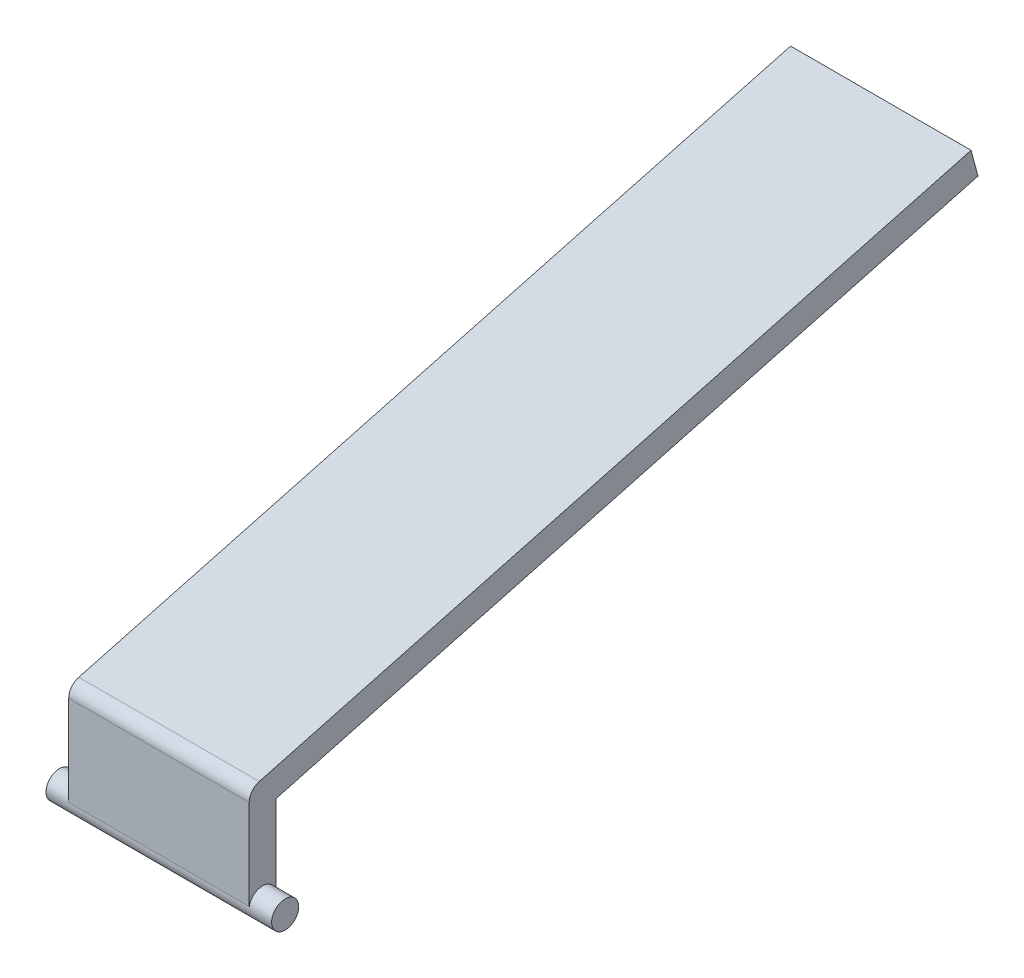
ISO-10303-21;
HEADER;
FILE_DESCRIPTION(('STEP AP214'),'2;1');
FILE_NAME('part.step','',(''),(''),'','','');
FILE_SCHEMA(('AUTOMOTIVE_DESIGN { 1 0 10303 214 1 1 1 1 }'));
ENDSEC;
DATA;
#1=APPLICATION_CONTEXT('core data for automotive mechanical design processes');
#2=APPLICATION_PROTOCOL_DEFINITION('international standard','automotive_design',2000,#1);
#3=PRODUCT_CONTEXT('',#1,'mechanical');
#4=PRODUCT('Part','Part','',(#3));
#5=PRODUCT_RELATED_PRODUCT_CATEGORY('part','',(#4));
#6=PRODUCT_DEFINITION_FORMATION('','',#4);
#7=PRODUCT_DEFINITION_CONTEXT('part definition',#1,'design');
#8=PRODUCT_DEFINITION('design','',#6,#7);
#9=PRODUCT_DEFINITION_SHAPE('','',#8);
#10=(LENGTH_UNIT() NAMED_UNIT(*) SI_UNIT(.MILLI.,.METRE.));
#11=(NAMED_UNIT(*) PLANE_ANGLE_UNIT() SI_UNIT($,.RADIAN.));
#12=(NAMED_UNIT(*) SI_UNIT($,.STERADIAN.) SOLID_ANGLE_UNIT());
#13=UNCERTAINTY_MEASURE_WITH_UNIT(LENGTH_MEASURE(1.E-05),#10,'distance_accuracy_value','');
#14=(GEOMETRIC_REPRESENTATION_CONTEXT(3) GLOBAL_UNCERTAINTY_ASSIGNED_CONTEXT((#13)) GLOBAL_UNIT_ASSIGNED_CONTEXT((#10,
#11,#12)) REPRESENTATION_CONTEXT('',''));
#15=CARTESIAN_POINT('',(0.,0.,0.));
#16=DIRECTION('',(0.,0.,1.));
#17=DIRECTION('',(1.,0.,0.));
#18=AXIS2_PLACEMENT_3D('',#15,#16,#17);
#19=CARTESIAN_POINT('',(2.5,0.,0.));
#20=DIRECTION('',(-1.,0.,0.));
#21=DIRECTION('',(0.,0.,1.));
#22=AXIS2_PLACEMENT_3D('',#19,#20,#21);
#23=CYLINDRICAL_SURFACE('',#22,0.3);
#24=DIRECTION('',(1.,0.,0.));
#25=VECTOR('',#24,1.);
#26=CARTESIAN_POINT('',(-2.,0.047528362088004,0.29621116588885));
#27=LINE('',#26,#25);
#28=CARTESIAN_POINT('',(-2.,0.0475283620880039,0.29621116588885));
#29=VERTEX_POINT('',#28);
#30=CARTESIAN_POINT('',(2.,0.0475283620880039,0.29621116588885));
#31=VERTEX_POINT('',#30);
#32=EDGE_CURVE('E53',#29,#31,#27,.T.);
#33=ORIENTED_EDGE('',*,*,#32,.F.);
#34=CARTESIAN_POINT('',(-2.,0.,0.));
#35=DIRECTION('',(-1.,0.,0.));
#36=DIRECTION('',(0.,0.,1.));
#37=AXIS2_PLACEMENT_3D('',#34,#35,#36);
#38=CIRCLE('',#37,0.3);
#39=CARTESIAN_POINT('',(-2.,0.0475283620880039,-0.29621116588885));
#40=VERTEX_POINT('',#39);
#41=EDGE_CURVE('E11',#29,#40,#38,.T.);
#42=ORIENTED_EDGE('',*,*,#41,.T.);
#43=DIRECTION('',(1.,0.,0.));
#44=VECTOR('',#43,1.);
#45=CARTESIAN_POINT('',(-2.,0.047528362088004,-0.29621116588885));
#46=LINE('',#45,#44);
#47=CARTESIAN_POINT('',(2.,0.047528362088004,-0.29621116588885));
#48=VERTEX_POINT('',#47);
#49=EDGE_CURVE('E91',#40,#48,#46,.T.);
#50=ORIENTED_EDGE('',*,*,#49,.T.);
#51=CARTESIAN_POINT('',(2.,0.,0.));
#52=DIRECTION('',(-1.,0.,0.));
#53=DIRECTION('',(0.,0.,1.));
#54=AXIS2_PLACEMENT_3D('',#51,#52,#53);
#55=CIRCLE('',#54,0.3);
#56=EDGE_CURVE('E47',#31,#48,#55,.T.);
#57=ORIENTED_EDGE('',*,*,#56,.F.);
#58=EDGE_LOOP('',(#33,#42,#50,#57));
#59=FACE_BOUND('',#58,.T.);
#60=CARTESIAN_POINT('',(2.5,0.,0.));
#61=DIRECTION('',(1.,0.,0.));
#62=DIRECTION('',(0.,0.,-1.));
#63=AXIS2_PLACEMENT_3D('',#60,#61,#62);
#64=CIRCLE('',#63,0.3);
#65=CARTESIAN_POINT('',(2.5,0.,-0.3));
#66=VERTEX_POINT('',#65);
#67=EDGE_CURVE('E113',#66,#66,#64,.T.);
#68=ORIENTED_EDGE('',*,*,#67,.F.);
#69=EDGE_LOOP('',(#68));
#70=FACE_BOUND('',#69,.T.);
#71=CARTESIAN_POINT('',(-2.5,0.,0.));
#72=DIRECTION('',(1.,0.,0.));
#73=DIRECTION('',(0.,0.,-1.));
#74=AXIS2_PLACEMENT_3D('',#71,#72,#73);
#75=CIRCLE('',#74,0.3);
#76=CARTESIAN_POINT('',(-2.5,0.,-0.3));
#77=VERTEX_POINT('',#76);
#78=EDGE_CURVE('E158',#77,#77,#75,.T.);
#79=ORIENTED_EDGE('',*,*,#78,.T.);
#80=EDGE_LOOP('',(#79));
#81=FACE_BOUND('',#80,.T.);
#82=ADVANCED_FACE('F39',(#59,#70,#81),#23,.T.);
#83=CARTESIAN_POINT('',(2.5,0.,0.));
#84=DIRECTION('',(1.,0.,0.));
#85=DIRECTION('',(0.,0.,-1.));
#86=AXIS2_PLACEMENT_3D('',#83,#84,#85);
#87=PLANE('',#86);
#88=ORIENTED_EDGE('',*,*,#67,.T.);
#89=EDGE_LOOP('',(#88));
#90=FACE_BOUND('',#89,.T.);
#91=ADVANCED_FACE('F184',(#90),#87,.T.);
#92=CARTESIAN_POINT('',(-2.5,0.,0.));
#93=DIRECTION('',(1.,0.,0.));
#94=DIRECTION('',(0.,0.,-1.));
#95=AXIS2_PLACEMENT_3D('',#92,#93,#94);
#96=PLANE('',#95);
#97=ORIENTED_EDGE('',*,*,#78,.F.);
#98=EDGE_LOOP('',(#97));
#99=FACE_BOUND('',#98,.T.);
#100=ADVANCED_FACE('F181',(#99),#96,.F.);
#101=CARTESIAN_POINT('',(-2.,0.047528362088004,0.29621116588885));
#102=DIRECTION('',(0.,0.,1.));
#103=DIRECTION('',(0.,-1.,0.));
#104=AXIS2_PLACEMENT_3D('',#101,#102,#103);
#105=PLANE('',#104);
#106=ORIENTED_EDGE('',*,*,#32,.T.);
#107=DIRECTION('',(0.,-1.,0.));
#108=VECTOR('',#107,1.);
#109=CARTESIAN_POINT('',(2.,0.047528362088004,0.29621116588885));
#110=LINE('',#109,#108);
#111=CARTESIAN_POINT('',(2.,2.047528362088,0.296211165888849));
#112=VERTEX_POINT('',#111);
#113=EDGE_CURVE('E111',#112,#31,#110,.T.);
#114=ORIENTED_EDGE('',*,*,#113,.F.);
#115=DIRECTION('',(1.,0.,0.));
#116=VECTOR('',#115,1.);
#117=CARTESIAN_POINT('',(-2.,2.047528362088,0.296211165888849));
#118=LINE('',#117,#116);
#119=CARTESIAN_POINT('',(-2.,2.047528362088,0.296211165888849));
#120=VERTEX_POINT('',#119);
#121=EDGE_CURVE('E159',#120,#112,#118,.T.);
#122=ORIENTED_EDGE('',*,*,#121,.F.);
#123=DIRECTION('',(0.,-1.,0.));
#124=VECTOR('',#123,1.);
#125=CARTESIAN_POINT('',(-2.,0.047528362088004,0.29621116588885));
#126=LINE('',#125,#124);
#127=EDGE_CURVE('E100',#120,#29,#126,.T.);
#128=ORIENTED_EDGE('',*,*,#127,.T.);
#129=EDGE_LOOP('',(#106,#114,#122,#128));
#130=FACE_BOUND('',#129,.T.);
#131=ADVANCED_FACE('F183',(#130),#105,.T.);
#132=CARTESIAN_POINT('',(-2.,2.047528362088,-0.00547167469361001));
#133=DIRECTION('',(1.,0.,0.));
#134=DIRECTION('',(0.,0.,-1.));
#135=AXIS2_PLACEMENT_3D('',#132,#133,#134);
#136=CYLINDRICAL_SURFACE('',#135,0.301682840582459);
#137=ORIENTED_EDGE('',*,*,#121,.T.);
#138=CARTESIAN_POINT('',(2.,2.047528362088,-0.00547167469361001));
#139=DIRECTION('',(1.,0.,0.));
#140=DIRECTION('',(0.,0.,1.));
#141=AXIS2_PLACEMENT_3D('',#138,#139,#140);
#142=CIRCLE('',#141,0.301682840582459);
#143=CARTESIAN_POINT('',(2.,2.33893160915485,0.0726095900297573));
#144=VERTEX_POINT('',#143);
#145=EDGE_CURVE('E129',#144,#112,#142,.T.);
#146=ORIENTED_EDGE('',*,*,#145,.F.);
#147=DIRECTION('',(1.,0.,0.));
#148=VECTOR('',#147,1.);
#149=CARTESIAN_POINT('',(-2.,2.33893160915485,0.0726095900297573));
#150=LINE('',#149,#148);
#151=CARTESIAN_POINT('',(-2.,2.33893160915485,0.0726095900297573));
#152=VERTEX_POINT('',#151);
#153=EDGE_CURVE('E162',#152,#144,#150,.T.);
#154=ORIENTED_EDGE('',*,*,#153,.F.);
#155=CARTESIAN_POINT('',(-2.,2.047528362088,-0.00547167469361001));
#156=DIRECTION('',(1.,0.,0.));
#157=DIRECTION('',(0.,0.,1.));
#158=AXIS2_PLACEMENT_3D('',#155,#156,#157);
#159=CIRCLE('',#158,0.301682840582459);
#160=EDGE_CURVE('E149',#152,#120,#159,.T.);
#161=ORIENTED_EDGE('',*,*,#160,.T.);
#162=EDGE_LOOP('',(#137,#146,#154,#161));
#163=FACE_BOUND('',#162,.T.);
#164=ADVANCED_FACE('F189',(#163),#136,.T.);
#165=CARTESIAN_POINT('',(-2.,2.33893160915485,0.0726095900297573));
#166=DIRECTION('',(0.,0.965925826289069,0.258819045102518));
#167=DIRECTION('',(0.,-0.258819045102518,0.965925826289069));
#168=AXIS2_PLACEMENT_3D('',#165,#166,#167);
#169=PLANE('',#168);
#170=ORIENTED_EDGE('',*,*,#153,.T.);
#171=DIRECTION('',(0.,-0.258819045102518,0.965925826289069));
#172=VECTOR('',#171,1.);
#173=CARTESIAN_POINT('',(2.,2.33893160915485,0.0726095900297573));
#174=LINE('',#173,#172);
#175=CARTESIAN_POINT('',(2.,6.56518961133466,-15.7));
#176=VERTEX_POINT('',#175);
#177=EDGE_CURVE('E125',#176,#144,#174,.T.);
#178=ORIENTED_EDGE('',*,*,#177,.F.);
#179=DIRECTION('',(1.,0.,0.));
#180=VECTOR('',#179,1.);
#181=CARTESIAN_POINT('',(-2.,6.56518961133466,-15.7));
#182=LINE('',#181,#180);
#183=CARTESIAN_POINT('',(-2.,6.56518961133466,-15.7));
#184=VERTEX_POINT('',#183);
#185=EDGE_CURVE('E165',#184,#176,#182,.T.);
#186=ORIENTED_EDGE('',*,*,#185,.F.);
#187=DIRECTION('',(0.,-0.258819045102518,0.965925826289069));
#188=VECTOR('',#187,1.);
#189=CARTESIAN_POINT('',(-2.,2.33893160915485,0.0726095900297573));
#190=LINE('',#189,#188);
#191=EDGE_CURVE('E145',#184,#152,#190,.T.);
#192=ORIENTED_EDGE('',*,*,#191,.T.);
#193=EDGE_LOOP('',(#170,#178,#186,#192));
#194=FACE_BOUND('',#193,.T.);
#195=ADVANCED_FACE('F220',(#194),#169,.T.);
#196=CARTESIAN_POINT('',(-2.,6.56518961133466,-15.7));
#197=DIRECTION('',(0.,0.258819045102516,-0.965925826289069));
#198=DIRECTION('',(0.,0.96592582628907,0.258819045102516));
#199=AXIS2_PLACEMENT_3D('',#196,#197,#198);
#200=PLANE('',#199);
#201=ORIENTED_EDGE('',*,*,#185,.T.);
#202=DIRECTION('',(0.,0.96592582628907,0.258819045102516));
#203=VECTOR('',#202,1.);
#204=CARTESIAN_POINT('',(2.,6.56518961133466,-15.7));
#205=LINE('',#204,#203);
#206=CARTESIAN_POINT('',(2.,5.99295358100018,-15.8533301822081));
#207=VERTEX_POINT('',#206);
#208=EDGE_CURVE('E119',#207,#176,#205,.T.);
#209=ORIENTED_EDGE('',*,*,#208,.F.);
#210=DIRECTION('',(1.,0.,0.));
#211=VECTOR('',#210,1.);
#212=CARTESIAN_POINT('',(-2.,5.99295358100018,-15.8533301822081));
#213=LINE('',#212,#211);
#214=CARTESIAN_POINT('',(-2.,5.99295358100018,-15.8533301822081));
#215=VERTEX_POINT('',#214);
#216=EDGE_CURVE('E168',#215,#207,#213,.T.);
#217=ORIENTED_EDGE('',*,*,#216,.F.);
#218=DIRECTION('',(0.,0.96592582628907,0.258819045102516));
#219=VECTOR('',#218,1.);
#220=CARTESIAN_POINT('',(-2.,6.56518961133466,-15.7));
#221=LINE('',#220,#219);
#222=EDGE_CURVE('E141',#215,#184,#221,.T.);
#223=ORIENTED_EDGE('',*,*,#222,.T.);
#224=EDGE_LOOP('',(#201,#209,#217,#223));
#225=FACE_BOUND('',#224,.T.);
#226=ADVANCED_FACE('F229',(#225),#200,.T.);
#227=CARTESIAN_POINT('',(-2.,1.82443610402262,-0.29621116588885));
#228=DIRECTION('',(0.,-0.965925826289069,-0.258819045102518));
#229=DIRECTION('',(0.,0.258819045102518,-0.965925826289069));
#230=AXIS2_PLACEMENT_3D('',#227,#228,#229);
#231=PLANE('',#230);
#232=ORIENTED_EDGE('',*,*,#216,.T.);
#233=DIRECTION('',(0.,0.258819045102518,-0.965925826289069));
#234=VECTOR('',#233,1.);
#235=CARTESIAN_POINT('',(2.,1.82443610402262,-0.29621116588885));
#236=LINE('',#235,#234);
#237=CARTESIAN_POINT('',(2.,1.82443610402262,-0.29621116588885));
#238=VERTEX_POINT('',#237);
#239=EDGE_CURVE('E116',#238,#207,#236,.T.);
#240=ORIENTED_EDGE('',*,*,#239,.F.);
#241=DIRECTION('',(1.,0.,0.));
#242=VECTOR('',#241,1.);
#243=CARTESIAN_POINT('',(-2.,1.82443610402262,-0.29621116588885));
#244=LINE('',#243,#242);
#245=CARTESIAN_POINT('',(-2.,1.82443610402262,-0.29621116588885));
#246=VERTEX_POINT('',#245);
#247=EDGE_CURVE('E99',#246,#238,#244,.T.);
#248=ORIENTED_EDGE('',*,*,#247,.F.);
#249=DIRECTION('',(0.,0.258819045102518,-0.965925826289069));
#250=VECTOR('',#249,1.);
#251=CARTESIAN_POINT('',(-2.,1.82443610402262,-0.29621116588885));
#252=LINE('',#251,#250);
#253=EDGE_CURVE('E137',#246,#215,#252,.T.);
#254=ORIENTED_EDGE('',*,*,#253,.T.);
#255=EDGE_LOOP('',(#232,#240,#248,#254));
#256=FACE_BOUND('',#255,.T.);
#257=ADVANCED_FACE('F238',(#256),#231,.T.);
#258=CARTESIAN_POINT('',(-2.,1.82443610402262,-0.29621116588885));
#259=DIRECTION('',(0.,0.,-1.));
#260=DIRECTION('',(0.,1.,0.));
#261=AXIS2_PLACEMENT_3D('',#258,#259,#260);
#262=PLANE('',#261);
#263=ORIENTED_EDGE('',*,*,#247,.T.);
#264=DIRECTION('',(0.,1.,0.));
#265=VECTOR('',#264,1.);
#266=CARTESIAN_POINT('',(2.,1.82443610402262,-0.29621116588885));
#267=LINE('',#266,#265);
#268=EDGE_CURVE('E107',#48,#238,#267,.T.);
#269=ORIENTED_EDGE('',*,*,#268,.F.);
#270=ORIENTED_EDGE('',*,*,#49,.F.);
#271=DIRECTION('',(0.,1.,0.));
#272=VECTOR('',#271,1.);
#273=CARTESIAN_POINT('',(-2.,1.82443610402262,-0.29621116588885));
#274=LINE('',#273,#272);
#275=EDGE_CURVE('E134',#40,#246,#274,.T.);
#276=ORIENTED_EDGE('',*,*,#275,.T.);
#277=EDGE_LOOP('',(#263,#269,#270,#276));
#278=FACE_BOUND('',#277,.T.);
#279=ADVANCED_FACE('F114',(#278),#262,.T.);
#280=CARTESIAN_POINT('',(-2.,2.047528362088,-0.00547167469361001));
#281=DIRECTION('',(-1.,0.,0.));
#282=DIRECTION('',(0.,0.,1.));
#283=AXIS2_PLACEMENT_3D('',#280,#281,#282);
#284=PLANE('',#283);
#285=ORIENTED_EDGE('',*,*,#41,.F.);
#286=ORIENTED_EDGE('',*,*,#127,.F.);
#287=ORIENTED_EDGE('',*,*,#160,.F.);
#288=ORIENTED_EDGE('',*,*,#191,.F.);
#289=ORIENTED_EDGE('',*,*,#222,.F.);
#290=ORIENTED_EDGE('',*,*,#253,.F.);
#291=ORIENTED_EDGE('',*,*,#275,.F.);
#292=EDGE_LOOP('',(#285,#286,#287,#288,#289,#290,#291));
#293=FACE_BOUND('',#292,.T.);
#294=ADVANCED_FACE('F255',(#293),#284,.T.);
#295=CARTESIAN_POINT('',(2.,2.047528362088,-0.00547167469361001));
#296=DIRECTION('',(-1.,0.,0.));
#297=DIRECTION('',(0.,0.,1.));
#298=AXIS2_PLACEMENT_3D('',#295,#296,#297);
#299=PLANE('',#298);
#300=ORIENTED_EDGE('',*,*,#113,.T.);
#301=ORIENTED_EDGE('',*,*,#56,.T.);
#302=ORIENTED_EDGE('',*,*,#268,.T.);
#303=ORIENTED_EDGE('',*,*,#239,.T.);
#304=ORIENTED_EDGE('',*,*,#208,.T.);
#305=ORIENTED_EDGE('',*,*,#177,.T.);
#306=ORIENTED_EDGE('',*,*,#145,.T.);
#307=EDGE_LOOP('',(#300,#301,#302,#303,#304,#305,#306));
#308=FACE_BOUND('',#307,.T.);
#309=ADVANCED_FACE('F105',(#308),#299,.F.);
#310=CLOSED_SHELL('',(#82,#91,#100,#131,#164,#195,#226,#257,#279,#294,#309));
#311=MANIFOLD_SOLID_BREP('B2',#310);
#312=ADVANCED_BREP_SHAPE_REPRESENTATION('',(#18,#311),#14);
#313=SHAPE_DEFINITION_REPRESENTATION(#9,#312);
ENDSEC;
END-ISO-10303-21;
